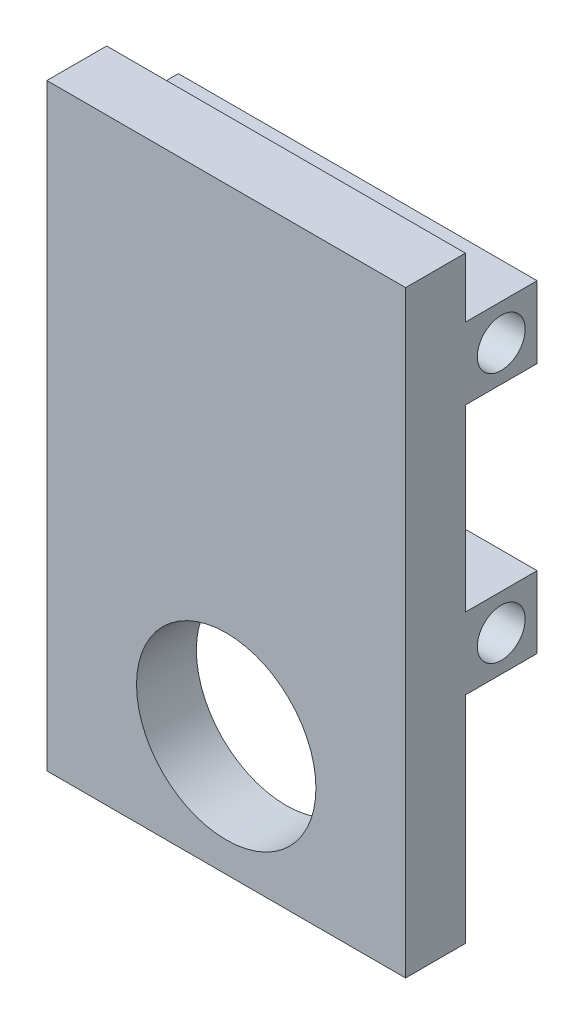
ISO-10303-21;
HEADER;
FILE_DESCRIPTION(('STEP AP214'),'2;1');
FILE_NAME('part.step','',(''),(''),'','','');
FILE_SCHEMA(('AUTOMOTIVE_DESIGN { 1 0 10303 214 1 1 1 1 }'));
ENDSEC;
DATA;
#1=APPLICATION_CONTEXT('core data for automotive mechanical design processes');
#2=APPLICATION_PROTOCOL_DEFINITION('international standard','automotive_design',2000,#1);
#3=PRODUCT_CONTEXT('',#1,'mechanical');
#4=PRODUCT('Part','Part','',(#3));
#5=PRODUCT_RELATED_PRODUCT_CATEGORY('part','',(#4));
#6=PRODUCT_DEFINITION_FORMATION('','',#4);
#7=PRODUCT_DEFINITION_CONTEXT('part definition',#1,'design');
#8=PRODUCT_DEFINITION('design','',#6,#7);
#9=PRODUCT_DEFINITION_SHAPE('','',#8);
#10=(LENGTH_UNIT() NAMED_UNIT(*) SI_UNIT(.MILLI.,.METRE.));
#11=(NAMED_UNIT(*) PLANE_ANGLE_UNIT() SI_UNIT($,.RADIAN.));
#12=(NAMED_UNIT(*) SI_UNIT($,.STERADIAN.) SOLID_ANGLE_UNIT());
#13=UNCERTAINTY_MEASURE_WITH_UNIT(LENGTH_MEASURE(1.E-05),#10,'distance_accuracy_value','');
#14=(GEOMETRIC_REPRESENTATION_CONTEXT(3) GLOBAL_UNCERTAINTY_ASSIGNED_CONTEXT((#13)) GLOBAL_UNIT_ASSIGNED_CONTEXT((#10,
#11,#12)) REPRESENTATION_CONTEXT('',''));
#15=CARTESIAN_POINT('',(0.,0.,0.));
#16=DIRECTION('',(0.,0.,1.));
#17=DIRECTION('',(1.,0.,0.));
#18=AXIS2_PLACEMENT_3D('',#15,#16,#17);
#19=CARTESIAN_POINT('',(60.,0.,0.));
#20=DIRECTION('',(1.,0.,0.));
#21=DIRECTION('',(0.,0.,-1.));
#22=AXIS2_PLACEMENT_3D('',#19,#20,#21);
#23=PLANE('',#22);
#24=CARTESIAN_POINT('',(60.,34.,-11.));
#25=DIRECTION('',(1.,0.,0.));
#26=DIRECTION('',(0.,0.,-1.));
#27=AXIS2_PLACEMENT_3D('',#24,#25,#26);
#28=CIRCLE('',#27,4.);
#29=CARTESIAN_POINT('',(60.,34.,-15.));
#30=VERTEX_POINT('',#29);
#31=EDGE_CURVE('E165',#30,#30,#28,.T.);
#32=ORIENTED_EDGE('',*,*,#31,.F.);
#33=EDGE_LOOP('',(#32));
#34=FACE_BOUND('',#33,.T.);
#35=DIRECTION('',(0.,-1.,0.));
#36=VECTOR('',#35,1.);
#37=CARTESIAN_POINT('',(60.,-50.,5.));
#38=LINE('',#37,#36);
#39=CARTESIAN_POINT('',(60.,50.,5.));
#40=VERTEX_POINT('',#39);
#41=CARTESIAN_POINT('',(60.,-50.,5.));
#42=VERTEX_POINT('',#41);
#43=EDGE_CURVE('E184',#40,#42,#38,.T.);
#44=ORIENTED_EDGE('',*,*,#43,.T.);
#45=DIRECTION('',(0.,0.,-1.));
#46=VECTOR('',#45,1.);
#47=CARTESIAN_POINT('',(60.,-50.,-5.));
#48=LINE('',#47,#46);
#49=CARTESIAN_POINT('',(60.,-50.,-5.));
#50=VERTEX_POINT('',#49);
#51=EDGE_CURVE('E112',#42,#50,#48,.T.);
#52=ORIENTED_EDGE('',*,*,#51,.T.);
#53=DIRECTION('',(0.,1.,0.));
#54=VECTOR('',#53,1.);
#55=CARTESIAN_POINT('',(60.,-50.,-5.));
#56=LINE('',#55,#54);
#57=CARTESIAN_POINT('',(60.,-14.,-5.));
#58=VERTEX_POINT('',#57);
#59=EDGE_CURVE('E212',#50,#58,#56,.T.);
#60=ORIENTED_EDGE('',*,*,#59,.T.);
#61=DIRECTION('',(0.,0.,-1.));
#62=VECTOR('',#61,1.);
#63=CARTESIAN_POINT('',(60.,-14.,-17.));
#64=LINE('',#63,#62);
#65=CARTESIAN_POINT('',(60.,-14.,-17.));
#66=VERTEX_POINT('',#65);
#67=EDGE_CURVE('E231',#58,#66,#64,.T.);
#68=ORIENTED_EDGE('',*,*,#67,.T.);
#69=DIRECTION('',(0.,1.,0.));
#70=VECTOR('',#69,1.);
#71=CARTESIAN_POINT('',(60.,-14.,-17.));
#72=LINE('',#71,#70);
#73=CARTESIAN_POINT('',(60.,-2.,-17.));
#74=VERTEX_POINT('',#73);
#75=EDGE_CURVE('E228',#66,#74,#72,.T.);
#76=ORIENTED_EDGE('',*,*,#75,.T.);
#77=DIRECTION('',(0.,0.,1.));
#78=VECTOR('',#77,1.);
#79=CARTESIAN_POINT('',(60.,-2.,-17.));
#80=LINE('',#79,#78);
#81=CARTESIAN_POINT('',(60.,-2.,-5.));
#82=VERTEX_POINT('',#81);
#83=EDGE_CURVE('E230',#74,#82,#80,.T.);
#84=ORIENTED_EDGE('',*,*,#83,.T.);
#85=DIRECTION('',(0.,1.,0.));
#86=VECTOR('',#85,1.);
#87=CARTESIAN_POINT('',(60.,-2.,-5.));
#88=LINE('',#87,#86);
#89=CARTESIAN_POINT('',(60.,28.,-5.));
#90=VERTEX_POINT('',#89);
#91=EDGE_CURVE('E233',#82,#90,#88,.T.);
#92=ORIENTED_EDGE('',*,*,#91,.T.);
#93=DIRECTION('',(0.,0.,-1.));
#94=VECTOR('',#93,1.);
#95=CARTESIAN_POINT('',(60.,28.,-17.));
#96=LINE('',#95,#94);
#97=CARTESIAN_POINT('',(60.,28.,-17.));
#98=VERTEX_POINT('',#97);
#99=EDGE_CURVE('E239',#90,#98,#96,.T.);
#100=ORIENTED_EDGE('',*,*,#99,.T.);
#101=DIRECTION('',(0.,1.,0.));
#102=VECTOR('',#101,1.);
#103=CARTESIAN_POINT('',(60.,28.,-17.));
#104=LINE('',#103,#102);
#105=CARTESIAN_POINT('',(60.,40.,-17.));
#106=VERTEX_POINT('',#105);
#107=EDGE_CURVE('E143',#98,#106,#104,.T.);
#108=ORIENTED_EDGE('',*,*,#107,.T.);
#109=DIRECTION('',(0.,0.,1.));
#110=VECTOR('',#109,1.);
#111=CARTESIAN_POINT('',(60.,40.,-17.));
#112=LINE('',#111,#110);
#113=CARTESIAN_POINT('',(60.,40.,-5.));
#114=VERTEX_POINT('',#113);
#115=EDGE_CURVE('E137',#106,#114,#112,.T.);
#116=ORIENTED_EDGE('',*,*,#115,.T.);
#117=DIRECTION('',(0.,1.,0.));
#118=VECTOR('',#117,1.);
#119=CARTESIAN_POINT('',(60.,40.,-5.));
#120=LINE('',#119,#118);
#121=CARTESIAN_POINT('',(60.,50.,-5.));
#122=VERTEX_POINT('',#121);
#123=EDGE_CURVE('E141',#114,#122,#120,.T.);
#124=ORIENTED_EDGE('',*,*,#123,.T.);
#125=DIRECTION('',(0.,0.,1.));
#126=VECTOR('',#125,1.);
#127=CARTESIAN_POINT('',(60.,50.,-5.));
#128=LINE('',#127,#126);
#129=EDGE_CURVE('E57',#122,#40,#128,.T.);
#130=ORIENTED_EDGE('',*,*,#129,.T.);
#131=EDGE_LOOP('',(#44,#52,#60,#68,#76,#84,#92,#100,#108,#116,#124,#130));
#132=FACE_BOUND('',#131,.T.);
#133=CARTESIAN_POINT('',(60.,-8.,-11.));
#134=DIRECTION('',(1.,0.,0.));
#135=DIRECTION('',(0.,0.,-1.));
#136=AXIS2_PLACEMENT_3D('',#133,#134,#135);
#137=CIRCLE('',#136,4.);
#138=CARTESIAN_POINT('',(60.,-8.,-15.));
#139=VERTEX_POINT('',#138);
#140=EDGE_CURVE('E291',#139,#139,#137,.T.);
#141=ORIENTED_EDGE('',*,*,#140,.F.);
#142=EDGE_LOOP('',(#141));
#143=FACE_BOUND('',#142,.T.);
#144=ADVANCED_FACE('F39',(#34,#132,#143),#23,.T.);
#145=CARTESIAN_POINT('',(0.,0.,0.));
#146=DIRECTION('',(1.,0.,0.));
#147=DIRECTION('',(0.,0.,-1.));
#148=AXIS2_PLACEMENT_3D('',#145,#146,#147);
#149=PLANE('',#148);
#150=DIRECTION('',(0.,-1.,0.));
#151=VECTOR('',#150,1.);
#152=CARTESIAN_POINT('',(0.,-50.,5.));
#153=LINE('',#152,#151);
#154=CARTESIAN_POINT('',(0.,50.,5.));
#155=VERTEX_POINT('',#154);
#156=CARTESIAN_POINT('',(0.,-50.,5.));
#157=VERTEX_POINT('',#156);
#158=EDGE_CURVE('E161',#155,#157,#153,.T.);
#159=ORIENTED_EDGE('',*,*,#158,.F.);
#160=DIRECTION('',(0.,0.,1.));
#161=VECTOR('',#160,1.);
#162=CARTESIAN_POINT('',(0.,50.,-5.));
#163=LINE('',#162,#161);
#164=CARTESIAN_POINT('',(0.,50.,-5.));
#165=VERTEX_POINT('',#164);
#166=EDGE_CURVE('E104',#165,#155,#163,.T.);
#167=ORIENTED_EDGE('',*,*,#166,.F.);
#168=DIRECTION('',(0.,1.,0.));
#169=VECTOR('',#168,1.);
#170=CARTESIAN_POINT('',(0.,40.,-5.));
#171=LINE('',#170,#169);
#172=CARTESIAN_POINT('',(0.,40.,-5.));
#173=VERTEX_POINT('',#172);
#174=EDGE_CURVE('E98',#173,#165,#171,.T.);
#175=ORIENTED_EDGE('',*,*,#174,.F.);
#176=DIRECTION('',(0.,0.,1.));
#177=VECTOR('',#176,1.);
#178=CARTESIAN_POINT('',(0.,40.,-17.));
#179=LINE('',#178,#177);
#180=CARTESIAN_POINT('',(0.,40.,-17.));
#181=VERTEX_POINT('',#180);
#182=EDGE_CURVE('E151',#181,#173,#179,.T.);
#183=ORIENTED_EDGE('',*,*,#182,.F.);
#184=DIRECTION('',(0.,1.,0.));
#185=VECTOR('',#184,1.);
#186=CARTESIAN_POINT('',(0.,28.,-17.));
#187=LINE('',#186,#185);
#188=CARTESIAN_POINT('',(0.,28.,-17.));
#189=VERTEX_POINT('',#188);
#190=EDGE_CURVE('E179',#189,#181,#187,.T.);
#191=ORIENTED_EDGE('',*,*,#190,.F.);
#192=DIRECTION('',(0.,0.,-1.));
#193=VECTOR('',#192,1.);
#194=CARTESIAN_POINT('',(0.,28.,-17.));
#195=LINE('',#194,#193);
#196=CARTESIAN_POINT('',(0.,28.,-5.));
#197=VERTEX_POINT('',#196);
#198=EDGE_CURVE('E177',#197,#189,#195,.T.);
#199=ORIENTED_EDGE('',*,*,#198,.F.);
#200=DIRECTION('',(0.,1.,0.));
#201=VECTOR('',#200,1.);
#202=CARTESIAN_POINT('',(0.,-2.,-5.));
#203=LINE('',#202,#201);
#204=CARTESIAN_POINT('',(0.,-2.,-5.));
#205=VERTEX_POINT('',#204);
#206=EDGE_CURVE('E175',#205,#197,#203,.T.);
#207=ORIENTED_EDGE('',*,*,#206,.F.);
#208=DIRECTION('',(0.,0.,1.));
#209=VECTOR('',#208,1.);
#210=CARTESIAN_POINT('',(0.,-2.,-17.));
#211=LINE('',#210,#209);
#212=CARTESIAN_POINT('',(0.,-2.,-17.));
#213=VERTEX_POINT('',#212);
#214=EDGE_CURVE('E173',#213,#205,#211,.T.);
#215=ORIENTED_EDGE('',*,*,#214,.F.);
#216=DIRECTION('',(0.,1.,0.));
#217=VECTOR('',#216,1.);
#218=CARTESIAN_POINT('',(0.,-14.,-17.));
#219=LINE('',#218,#217);
#220=CARTESIAN_POINT('',(0.,-14.,-17.));
#221=VERTEX_POINT('',#220);
#222=EDGE_CURVE('E171',#221,#213,#219,.T.);
#223=ORIENTED_EDGE('',*,*,#222,.F.);
#224=DIRECTION('',(0.,0.,-1.));
#225=VECTOR('',#224,1.);
#226=CARTESIAN_POINT('',(0.,-14.,-17.));
#227=LINE('',#226,#225);
#228=CARTESIAN_POINT('',(0.,-14.,-5.));
#229=VERTEX_POINT('',#228);
#230=EDGE_CURVE('E169',#229,#221,#227,.T.);
#231=ORIENTED_EDGE('',*,*,#230,.F.);
#232=DIRECTION('',(0.,1.,0.));
#233=VECTOR('',#232,1.);
#234=CARTESIAN_POINT('',(0.,-50.,-5.));
#235=LINE('',#234,#233);
#236=CARTESIAN_POINT('',(0.,-50.,-5.));
#237=VERTEX_POINT('',#236);
#238=EDGE_CURVE('E167',#237,#229,#235,.T.);
#239=ORIENTED_EDGE('',*,*,#238,.F.);
#240=DIRECTION('',(0.,0.,-1.));
#241=VECTOR('',#240,1.);
#242=CARTESIAN_POINT('',(0.,-50.,-5.));
#243=LINE('',#242,#241);
#244=EDGE_CURVE('E164',#157,#237,#243,.T.);
#245=ORIENTED_EDGE('',*,*,#244,.F.);
#246=EDGE_LOOP('',(#159,#167,#175,#183,#191,#199,#207,#215,#223,#231,#239,#245));
#247=FACE_BOUND('',#246,.T.);
#248=CARTESIAN_POINT('',(0.,34.,-11.));
#249=DIRECTION('',(1.,0.,0.));
#250=DIRECTION('',(0.,0.,-1.));
#251=AXIS2_PLACEMENT_3D('',#248,#249,#250);
#252=CIRCLE('',#251,4.);
#253=CARTESIAN_POINT('',(0.,34.,-15.));
#254=VERTEX_POINT('',#253);
#255=EDGE_CURVE('E296',#254,#254,#252,.T.);
#256=ORIENTED_EDGE('',*,*,#255,.T.);
#257=EDGE_LOOP('',(#256));
#258=FACE_BOUND('',#257,.T.);
#259=CARTESIAN_POINT('',(0.,-8.,-11.));
#260=DIRECTION('',(1.,0.,0.));
#261=DIRECTION('',(0.,0.,-1.));
#262=AXIS2_PLACEMENT_3D('',#259,#260,#261);
#263=CIRCLE('',#262,4.);
#264=CARTESIAN_POINT('',(0.,-8.,-15.));
#265=VERTEX_POINT('',#264);
#266=EDGE_CURVE('E289',#265,#265,#263,.T.);
#267=ORIENTED_EDGE('',*,*,#266,.T.);
#268=EDGE_LOOP('',(#267));
#269=FACE_BOUND('',#268,.T.);
#270=ADVANCED_FACE('F216',(#247,#258,#269),#149,.F.);
#271=CARTESIAN_POINT('',(60.,-50.,5.));
#272=DIRECTION('',(0.,0.,-1.));
#273=DIRECTION('',(-1.,0.,0.));
#274=AXIS2_PLACEMENT_3D('',#271,#272,#273);
#275=PLANE('',#274);
#276=CARTESIAN_POINT('',(30.,-30.,5.));
#277=DIRECTION('',(0.,0.,1.));
#278=DIRECTION('',(1.,0.,0.));
#279=AXIS2_PLACEMENT_3D('',#276,#277,#278);
#280=CIRCLE('',#279,15.);
#281=CARTESIAN_POINT('',(45.,-30.,5.));
#282=VERTEX_POINT('',#281);
#283=EDGE_CURVE('E285',#282,#282,#280,.T.);
#284=ORIENTED_EDGE('',*,*,#283,.F.);
#285=EDGE_LOOP('',(#284));
#286=FACE_BOUND('',#285,.T.);
#287=ORIENTED_EDGE('',*,*,#158,.T.);
#288=DIRECTION('',(-1.,0.,0.));
#289=VECTOR('',#288,1.);
#290=CARTESIAN_POINT('',(60.,-50.,5.));
#291=LINE('',#290,#289);
#292=EDGE_CURVE('E11',#42,#157,#291,.T.);
#293=ORIENTED_EDGE('',*,*,#292,.F.);
#294=ORIENTED_EDGE('',*,*,#43,.F.);
#295=DIRECTION('',(-1.,0.,0.));
#296=VECTOR('',#295,1.);
#297=CARTESIAN_POINT('',(60.,50.,5.));
#298=LINE('',#297,#296);
#299=EDGE_CURVE('E157',#40,#155,#298,.T.);
#300=ORIENTED_EDGE('',*,*,#299,.T.);
#301=EDGE_LOOP('',(#287,#293,#294,#300));
#302=FACE_BOUND('',#301,.T.);
#303=ADVANCED_FACE('F41',(#286,#302),#275,.F.);
#304=CARTESIAN_POINT('',(60.,-50.,-5.));
#305=DIRECTION('',(0.,1.,0.));
#306=DIRECTION('',(0.,0.,1.));
#307=AXIS2_PLACEMENT_3D('',#304,#305,#306);
#308=PLANE('',#307);
#309=ORIENTED_EDGE('',*,*,#244,.T.);
#310=DIRECTION('',(-1.,0.,0.));
#311=VECTOR('',#310,1.);
#312=CARTESIAN_POINT('',(60.,-50.,-5.));
#313=LINE('',#312,#311);
#314=EDGE_CURVE('E49',#50,#237,#313,.T.);
#315=ORIENTED_EDGE('',*,*,#314,.F.);
#316=ORIENTED_EDGE('',*,*,#51,.F.);
#317=ORIENTED_EDGE('',*,*,#292,.T.);
#318=EDGE_LOOP('',(#309,#315,#316,#317));
#319=FACE_BOUND('',#318,.T.);
#320=ADVANCED_FACE('F310',(#319),#308,.F.);
#321=CARTESIAN_POINT('',(60.,-50.,-5.));
#322=DIRECTION('',(0.,0.,1.));
#323=DIRECTION('',(0.,-1.,0.));
#324=AXIS2_PLACEMENT_3D('',#321,#322,#323);
#325=PLANE('',#324);
#326=CARTESIAN_POINT('',(30.,-30.,-5.));
#327=DIRECTION('',(0.,0.,1.));
#328=DIRECTION('',(0.,-1.,0.));
#329=AXIS2_PLACEMENT_3D('',#326,#327,#328);
#330=CIRCLE('',#329,15.);
#331=CARTESIAN_POINT('',(30.,-45.,-5.));
#332=VERTEX_POINT('',#331);
#333=EDGE_CURVE('E43',#332,#332,#330,.T.);
#334=ORIENTED_EDGE('',*,*,#333,.T.);
#335=EDGE_LOOP('',(#334));
#336=FACE_BOUND('',#335,.T.);
#337=ORIENTED_EDGE('',*,*,#238,.T.);
#338=DIRECTION('',(-1.,0.,0.));
#339=VECTOR('',#338,1.);
#340=CARTESIAN_POINT('',(60.,-14.,-5.));
#341=LINE('',#340,#339);
#342=EDGE_CURVE('E203',#58,#229,#341,.T.);
#343=ORIENTED_EDGE('',*,*,#342,.F.);
#344=ORIENTED_EDGE('',*,*,#59,.F.);
#345=ORIENTED_EDGE('',*,*,#314,.T.);
#346=EDGE_LOOP('',(#337,#343,#344,#345));
#347=FACE_BOUND('',#346,.T.);
#348=ADVANCED_FACE('F210',(#336,#347),#325,.F.);
#349=CARTESIAN_POINT('',(60.,-14.,-17.));
#350=DIRECTION('',(0.,1.,0.));
#351=DIRECTION('',(0.,0.,1.));
#352=AXIS2_PLACEMENT_3D('',#349,#350,#351);
#353=PLANE('',#352);
#354=ORIENTED_EDGE('',*,*,#230,.T.);
#355=DIRECTION('',(-1.,0.,0.));
#356=VECTOR('',#355,1.);
#357=CARTESIAN_POINT('',(60.,-14.,-17.));
#358=LINE('',#357,#356);
#359=EDGE_CURVE('E200',#66,#221,#358,.T.);
#360=ORIENTED_EDGE('',*,*,#359,.F.);
#361=ORIENTED_EDGE('',*,*,#67,.F.);
#362=ORIENTED_EDGE('',*,*,#342,.T.);
#363=EDGE_LOOP('',(#354,#360,#361,#362));
#364=FACE_BOUND('',#363,.T.);
#365=ADVANCED_FACE('F222',(#364),#353,.F.);
#366=CARTESIAN_POINT('',(60.,-14.,-17.));
#367=DIRECTION('',(0.,0.,1.));
#368=DIRECTION('',(1.,0.,0.));
#369=AXIS2_PLACEMENT_3D('',#366,#367,#368);
#370=PLANE('',#369);
#371=ORIENTED_EDGE('',*,*,#222,.T.);
#372=DIRECTION('',(-1.,0.,0.));
#373=VECTOR('',#372,1.);
#374=CARTESIAN_POINT('',(60.,-2.,-17.));
#375=LINE('',#374,#373);
#376=EDGE_CURVE('E197',#74,#213,#375,.T.);
#377=ORIENTED_EDGE('',*,*,#376,.F.);
#378=ORIENTED_EDGE('',*,*,#75,.F.);
#379=ORIENTED_EDGE('',*,*,#359,.T.);
#380=EDGE_LOOP('',(#371,#377,#378,#379));
#381=FACE_BOUND('',#380,.T.);
#382=ADVANCED_FACE('F226',(#381),#370,.F.);
#383=CARTESIAN_POINT('',(60.,-2.,-17.));
#384=DIRECTION('',(0.,-1.,0.));
#385=DIRECTION('',(0.,0.,-1.));
#386=AXIS2_PLACEMENT_3D('',#383,#384,#385);
#387=PLANE('',#386);
#388=ORIENTED_EDGE('',*,*,#214,.T.);
#389=DIRECTION('',(-1.,0.,0.));
#390=VECTOR('',#389,1.);
#391=CARTESIAN_POINT('',(60.,-2.,-5.));
#392=LINE('',#391,#390);
#393=EDGE_CURVE('E194',#82,#205,#392,.T.);
#394=ORIENTED_EDGE('',*,*,#393,.F.);
#395=ORIENTED_EDGE('',*,*,#83,.F.);
#396=ORIENTED_EDGE('',*,*,#376,.T.);
#397=EDGE_LOOP('',(#388,#394,#395,#396));
#398=FACE_BOUND('',#397,.T.);
#399=ADVANCED_FACE('F320',(#398),#387,.F.);
#400=CARTESIAN_POINT('',(60.,-2.,-5.));
#401=DIRECTION('',(0.,0.,1.));
#402=DIRECTION('',(1.,0.,0.));
#403=AXIS2_PLACEMENT_3D('',#400,#401,#402);
#404=PLANE('',#403);
#405=ORIENTED_EDGE('',*,*,#206,.T.);
#406=DIRECTION('',(-1.,0.,0.));
#407=VECTOR('',#406,1.);
#408=CARTESIAN_POINT('',(60.,28.,-5.));
#409=LINE('',#408,#407);
#410=EDGE_CURVE('E191',#90,#197,#409,.T.);
#411=ORIENTED_EDGE('',*,*,#410,.F.);
#412=ORIENTED_EDGE('',*,*,#91,.F.);
#413=ORIENTED_EDGE('',*,*,#393,.T.);
#414=EDGE_LOOP('',(#405,#411,#412,#413));
#415=FACE_BOUND('',#414,.T.);
#416=ADVANCED_FACE('F323',(#415),#404,.F.);
#417=CARTESIAN_POINT('',(60.,28.,-17.));
#418=DIRECTION('',(0.,1.,0.));
#419=DIRECTION('',(0.,0.,1.));
#420=AXIS2_PLACEMENT_3D('',#417,#418,#419);
#421=PLANE('',#420);
#422=ORIENTED_EDGE('',*,*,#198,.T.);
#423=DIRECTION('',(-1.,0.,0.));
#424=VECTOR('',#423,1.);
#425=CARTESIAN_POINT('',(60.,28.,-17.));
#426=LINE('',#425,#424);
#427=EDGE_CURVE('E188',#98,#189,#426,.T.);
#428=ORIENTED_EDGE('',*,*,#427,.F.);
#429=ORIENTED_EDGE('',*,*,#99,.F.);
#430=ORIENTED_EDGE('',*,*,#410,.T.);
#431=EDGE_LOOP('',(#422,#428,#429,#430));
#432=FACE_BOUND('',#431,.T.);
#433=ADVANCED_FACE('F245',(#432),#421,.F.);
#434=CARTESIAN_POINT('',(60.,28.,-17.));
#435=DIRECTION('',(0.,0.,1.));
#436=DIRECTION('',(0.,-1.,0.));
#437=AXIS2_PLACEMENT_3D('',#434,#435,#436);
#438=PLANE('',#437);
#439=ORIENTED_EDGE('',*,*,#190,.T.);
#440=DIRECTION('',(-1.,0.,0.));
#441=VECTOR('',#440,1.);
#442=CARTESIAN_POINT('',(60.,40.,-17.));
#443=LINE('',#442,#441);
#444=EDGE_CURVE('E152',#106,#181,#443,.T.);
#445=ORIENTED_EDGE('',*,*,#444,.F.);
#446=ORIENTED_EDGE('',*,*,#107,.F.);
#447=ORIENTED_EDGE('',*,*,#427,.T.);
#448=EDGE_LOOP('',(#439,#445,#446,#447));
#449=FACE_BOUND('',#448,.T.);
#450=ADVANCED_FACE('F249',(#449),#438,.F.);
#451=CARTESIAN_POINT('',(60.,40.,-17.));
#452=DIRECTION('',(0.,-1.,0.));
#453=DIRECTION('',(0.,0.,-1.));
#454=AXIS2_PLACEMENT_3D('',#451,#452,#453);
#455=PLANE('',#454);
#456=ORIENTED_EDGE('',*,*,#182,.T.);
#457=DIRECTION('',(-1.,0.,0.));
#458=VECTOR('',#457,1.);
#459=CARTESIAN_POINT('',(60.,40.,-5.));
#460=LINE('',#459,#458);
#461=EDGE_CURVE('E148',#114,#173,#460,.T.);
#462=ORIENTED_EDGE('',*,*,#461,.F.);
#463=ORIENTED_EDGE('',*,*,#115,.F.);
#464=ORIENTED_EDGE('',*,*,#444,.T.);
#465=EDGE_LOOP('',(#456,#462,#463,#464));
#466=FACE_BOUND('',#465,.T.);
#467=ADVANCED_FACE('F149',(#466),#455,.F.);
#468=CARTESIAN_POINT('',(60.,40.,-5.));
#469=DIRECTION('',(0.,0.,1.));
#470=DIRECTION('',(0.,-1.,0.));
#471=AXIS2_PLACEMENT_3D('',#468,#469,#470);
#472=PLANE('',#471);
#473=ORIENTED_EDGE('',*,*,#174,.T.);
#474=DIRECTION('',(-1.,0.,0.));
#475=VECTOR('',#474,1.);
#476=CARTESIAN_POINT('',(60.,50.,-5.));
#477=LINE('',#476,#475);
#478=EDGE_CURVE('E153',#122,#165,#477,.T.);
#479=ORIENTED_EDGE('',*,*,#478,.F.);
#480=ORIENTED_EDGE('',*,*,#123,.F.);
#481=ORIENTED_EDGE('',*,*,#461,.T.);
#482=EDGE_LOOP('',(#473,#479,#480,#481));
#483=FACE_BOUND('',#482,.T.);
#484=ADVANCED_FACE('F155',(#483),#472,.F.);
#485=CARTESIAN_POINT('',(60.,50.,-5.));
#486=DIRECTION('',(0.,-1.,0.));
#487=DIRECTION('',(0.,0.,-1.));
#488=AXIS2_PLACEMENT_3D('',#485,#486,#487);
#489=PLANE('',#488);
#490=ORIENTED_EDGE('',*,*,#166,.T.);
#491=ORIENTED_EDGE('',*,*,#299,.F.);
#492=ORIENTED_EDGE('',*,*,#129,.F.);
#493=ORIENTED_EDGE('',*,*,#478,.T.);
#494=EDGE_LOOP('',(#490,#491,#492,#493));
#495=FACE_BOUND('',#494,.T.);
#496=ADVANCED_FACE('F253',(#495),#489,.F.);
#497=CARTESIAN_POINT('',(60.,34.,-11.));
#498=DIRECTION('',(-1.,0.,0.));
#499=DIRECTION('',(0.,0.,1.));
#500=AXIS2_PLACEMENT_3D('',#497,#498,#499);
#501=CYLINDRICAL_SURFACE('',#500,4.);
#502=ORIENTED_EDGE('',*,*,#31,.T.);
#503=EDGE_LOOP('',(#502));
#504=FACE_BOUND('',#503,.T.);
#505=ORIENTED_EDGE('',*,*,#255,.F.);
#506=EDGE_LOOP('',(#505));
#507=FACE_BOUND('',#506,.T.);
#508=ADVANCED_FACE('F255',(#504,#507),#501,.F.);
#509=CARTESIAN_POINT('',(60.,-8.,-11.));
#510=DIRECTION('',(-1.,0.,0.));
#511=DIRECTION('',(0.,0.,1.));
#512=AXIS2_PLACEMENT_3D('',#509,#510,#511);
#513=CYLINDRICAL_SURFACE('',#512,4.);
#514=ORIENTED_EDGE('',*,*,#140,.T.);
#515=EDGE_LOOP('',(#514));
#516=FACE_BOUND('',#515,.T.);
#517=ORIENTED_EDGE('',*,*,#266,.F.);
#518=EDGE_LOOP('',(#517));
#519=FACE_BOUND('',#518,.T.);
#520=ADVANCED_FACE('F261',(#516,#519),#513,.F.);
#521=CARTESIAN_POINT('',(30.,-30.,-55.));
#522=DIRECTION('',(0.,0.,1.));
#523=DIRECTION('',(1.,0.,0.));
#524=AXIS2_PLACEMENT_3D('',#521,#522,#523);
#525=CYLINDRICAL_SURFACE('',#524,15.);
#526=ORIENTED_EDGE('',*,*,#283,.T.);
#527=EDGE_LOOP('',(#526));
#528=FACE_BOUND('',#527,.T.);
#529=ORIENTED_EDGE('',*,*,#333,.F.);
#530=EDGE_LOOP('',(#529));
#531=FACE_BOUND('',#530,.T.);
#532=ADVANCED_FACE('F276',(#528,#531),#525,.F.);
#533=CLOSED_SHELL('',(#144,#270,#303,#320,#348,#365,#382,#399,#416,#433,#450,#467,#484,#496,
#508,#520,#532));
#534=MANIFOLD_SOLID_BREP('B2',#533);
#535=ADVANCED_BREP_SHAPE_REPRESENTATION('',(#18,#534),#14);
#536=SHAPE_DEFINITION_REPRESENTATION(#9,#535);
ENDSEC;
END-ISO-10303-21;
